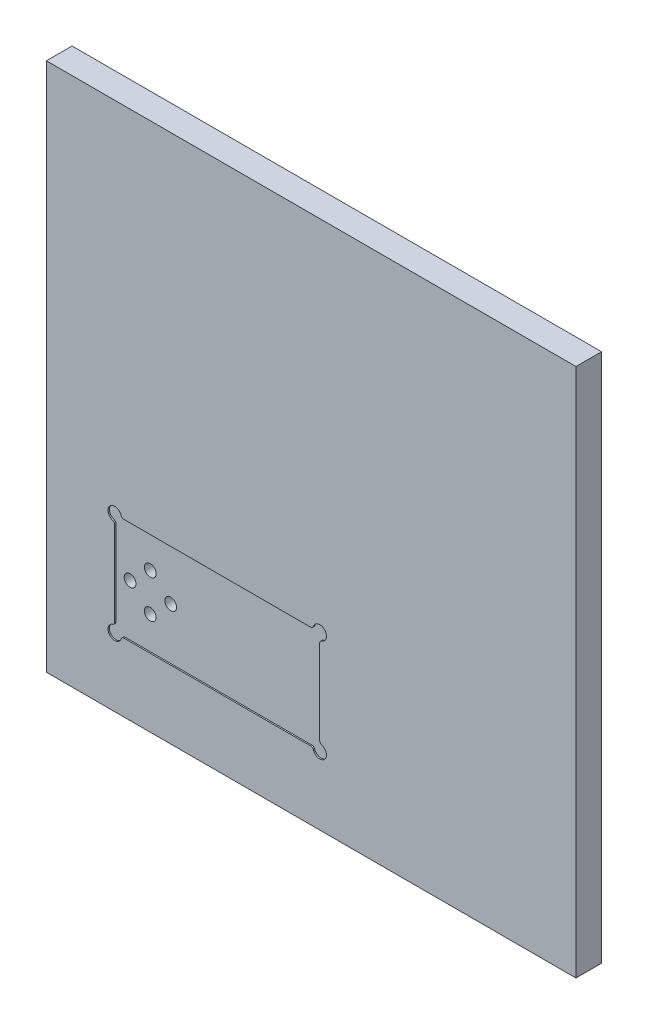
ISO-10303-21;
HEADER;
FILE_DESCRIPTION(('STEP AP214'),'2;1');
FILE_NAME('part.step','',(''),(''),'','','');
FILE_SCHEMA(('AUTOMOTIVE_DESIGN { 1 0 10303 214 1 1 1 1 }'));
ENDSEC;
DATA;
#1=APPLICATION_CONTEXT('core data for automotive mechanical design processes');
#2=APPLICATION_PROTOCOL_DEFINITION('international standard','automotive_design',2000,#1);
#3=PRODUCT_CONTEXT('',#1,'mechanical');
#4=PRODUCT('Part','Part','',(#3));
#5=PRODUCT_RELATED_PRODUCT_CATEGORY('part','',(#4));
#6=PRODUCT_DEFINITION_FORMATION('','',#4);
#7=PRODUCT_DEFINITION_CONTEXT('part definition',#1,'design');
#8=PRODUCT_DEFINITION('design','',#6,#7);
#9=PRODUCT_DEFINITION_SHAPE('','',#8);
#10=(LENGTH_UNIT() NAMED_UNIT(*) SI_UNIT(.MILLI.,.METRE.));
#11=(NAMED_UNIT(*) PLANE_ANGLE_UNIT() SI_UNIT($,.RADIAN.));
#12=(NAMED_UNIT(*) SI_UNIT($,.STERADIAN.) SOLID_ANGLE_UNIT());
#13=UNCERTAINTY_MEASURE_WITH_UNIT(LENGTH_MEASURE(1.E-05),#10,'distance_accuracy_value','');
#14=(GEOMETRIC_REPRESENTATION_CONTEXT(3) GLOBAL_UNCERTAINTY_ASSIGNED_CONTEXT((#13)) GLOBAL_UNIT_ASSIGNED_CONTEXT((#10,
#11,#12)) REPRESENTATION_CONTEXT('',''));
#15=CARTESIAN_POINT('',(0.,0.,0.));
#16=DIRECTION('',(0.,0.,1.));
#17=DIRECTION('',(1.,0.,0.));
#18=AXIS2_PLACEMENT_3D('',#15,#16,#17);
#19=CARTESIAN_POINT('',(0.,0.,19.05));
#20=DIRECTION('',(1.,0.,0.));
#21=DIRECTION('',(0.,0.,-1.));
#22=AXIS2_PLACEMENT_3D('',#19,#20,#21);
#23=PLANE('',#22);
#24=DIRECTION('',(0.,-1.,0.));
#25=VECTOR('',#24,1.);
#26=CARTESIAN_POINT('',(0.,0.,0.));
#27=LINE('',#26,#25);
#28=CARTESIAN_POINT('',(0.,393.7,0.));
#29=VERTEX_POINT('',#28);
#30=CARTESIAN_POINT('',(0.,0.,0.));
#31=VERTEX_POINT('',#30);
#32=EDGE_CURVE('E207',#29,#31,#27,.T.);
#33=ORIENTED_EDGE('',*,*,#32,.T.);
#34=DIRECTION('',(0.,0.,-1.));
#35=VECTOR('',#34,1.);
#36=CARTESIAN_POINT('',(0.,0.,19.05));
#37=LINE('',#36,#35);
#38=CARTESIAN_POINT('',(0.,0.,19.05));
#39=VERTEX_POINT('',#38);
#40=EDGE_CURVE('E186',#39,#31,#37,.T.);
#41=ORIENTED_EDGE('',*,*,#40,.F.);
#42=DIRECTION('',(0.,-1.,0.));
#43=VECTOR('',#42,1.);
#44=CARTESIAN_POINT('',(0.,0.,19.05));
#45=LINE('',#44,#43);
#46=CARTESIAN_POINT('',(0.,393.7,19.05));
#47=VERTEX_POINT('',#46);
#48=EDGE_CURVE('E194',#47,#39,#45,.T.);
#49=ORIENTED_EDGE('',*,*,#48,.F.);
#50=DIRECTION('',(0.,0.,-1.));
#51=VECTOR('',#50,1.);
#52=CARTESIAN_POINT('',(0.,393.7,19.05));
#53=LINE('',#52,#51);
#54=EDGE_CURVE('E320',#47,#29,#53,.T.);
#55=ORIENTED_EDGE('',*,*,#54,.T.);
#56=EDGE_LOOP('',(#33,#41,#49,#55));
#57=FACE_BOUND('',#56,.T.);
#58=ADVANCED_FACE('F44',(#57),#23,.F.);
#59=CARTESIAN_POINT('',(0.,0.,19.05));
#60=DIRECTION('',(0.,1.,0.));
#61=DIRECTION('',(0.,0.,1.));
#62=AXIS2_PLACEMENT_3D('',#59,#60,#61);
#63=PLANE('',#62);
#64=DIRECTION('',(1.,0.,0.));
#65=VECTOR('',#64,1.);
#66=CARTESIAN_POINT('',(0.,0.,0.));
#67=LINE('',#66,#65);
#68=CARTESIAN_POINT('',(393.7,0.,0.));
#69=VERTEX_POINT('',#68);
#70=EDGE_CURVE('E323',#31,#69,#67,.T.);
#71=ORIENTED_EDGE('',*,*,#70,.T.);
#72=DIRECTION('',(0.,0.,-1.));
#73=VECTOR('',#72,1.);
#74=CARTESIAN_POINT('',(393.7,0.,19.05));
#75=LINE('',#74,#73);
#76=CARTESIAN_POINT('',(393.7,0.,19.05));
#77=VERTEX_POINT('',#76);
#78=EDGE_CURVE('E189',#77,#69,#75,.T.);
#79=ORIENTED_EDGE('',*,*,#78,.F.);
#80=DIRECTION('',(1.,0.,0.));
#81=VECTOR('',#80,1.);
#82=CARTESIAN_POINT('',(0.,0.,19.05));
#83=LINE('',#82,#81);
#84=EDGE_CURVE('E182',#39,#77,#83,.T.);
#85=ORIENTED_EDGE('',*,*,#84,.F.);
#86=ORIENTED_EDGE('',*,*,#40,.T.);
#87=EDGE_LOOP('',(#71,#79,#85,#86));
#88=FACE_BOUND('',#87,.T.);
#89=ADVANCED_FACE('F184',(#88),#63,.F.);
#90=CARTESIAN_POINT('',(393.7,0.,19.05));
#91=DIRECTION('',(-1.,0.,0.));
#92=DIRECTION('',(0.,0.,1.));
#93=AXIS2_PLACEMENT_3D('',#90,#91,#92);
#94=PLANE('',#93);
#95=DIRECTION('',(0.,1.,0.));
#96=VECTOR('',#95,1.);
#97=CARTESIAN_POINT('',(393.7,0.,0.));
#98=LINE('',#97,#96);
#99=CARTESIAN_POINT('',(393.7,393.7,0.));
#100=VERTEX_POINT('',#99);
#101=EDGE_CURVE('E326',#69,#100,#98,.T.);
#102=ORIENTED_EDGE('',*,*,#101,.T.);
#103=DIRECTION('',(0.,0.,-1.));
#104=VECTOR('',#103,1.);
#105=CARTESIAN_POINT('',(393.7,393.7,19.05));
#106=LINE('',#105,#104);
#107=CARTESIAN_POINT('',(393.7,393.7,19.05));
#108=VERTEX_POINT('',#107);
#109=EDGE_CURVE('E215',#108,#100,#106,.T.);
#110=ORIENTED_EDGE('',*,*,#109,.F.);
#111=DIRECTION('',(0.,1.,0.));
#112=VECTOR('',#111,1.);
#113=CARTESIAN_POINT('',(393.7,0.,19.05));
#114=LINE('',#113,#112);
#115=EDGE_CURVE('E193',#77,#108,#114,.T.);
#116=ORIENTED_EDGE('',*,*,#115,.F.);
#117=ORIENTED_EDGE('',*,*,#78,.T.);
#118=EDGE_LOOP('',(#102,#110,#116,#117));
#119=FACE_BOUND('',#118,.T.);
#120=ADVANCED_FACE('F342',(#119),#94,.F.);
#121=CARTESIAN_POINT('',(0.,393.7,19.05));
#122=DIRECTION('',(0.,-1.,0.));
#123=DIRECTION('',(0.,0.,-1.));
#124=AXIS2_PLACEMENT_3D('',#121,#122,#123);
#125=PLANE('',#124);
#126=DIRECTION('',(-1.,0.,0.));
#127=VECTOR('',#126,1.);
#128=CARTESIAN_POINT('',(0.,393.7,0.));
#129=LINE('',#128,#127);
#130=EDGE_CURVE('E204',#100,#29,#129,.T.);
#131=ORIENTED_EDGE('',*,*,#130,.T.);
#132=ORIENTED_EDGE('',*,*,#54,.F.);
#133=DIRECTION('',(-1.,0.,0.));
#134=VECTOR('',#133,1.);
#135=CARTESIAN_POINT('',(0.,393.7,19.05));
#136=LINE('',#135,#134);
#137=EDGE_CURVE('E199',#108,#47,#136,.T.);
#138=ORIENTED_EDGE('',*,*,#137,.F.);
#139=ORIENTED_EDGE('',*,*,#109,.T.);
#140=EDGE_LOOP('',(#131,#132,#138,#139));
#141=FACE_BOUND('',#140,.T.);
#142=ADVANCED_FACE('F337',(#141),#125,.F.);
#143=CARTESIAN_POINT('',(0.,0.,19.05));
#144=DIRECTION('',(0.,0.,-1.));
#145=DIRECTION('',(-1.,0.,0.));
#146=AXIS2_PLACEMENT_3D('',#143,#144,#145);
#147=PLANE('',#146);
#148=CARTESIAN_POINT('',(203.2,127.254,19.05));
#149=DIRECTION('',(0.,0.,1.));
#150=DIRECTION('',(1.,0.,0.));
#151=AXIS2_PLACEMENT_3D('',#148,#149,#150);
#152=CIRCLE('',#151,5.);
#153=CARTESIAN_POINT('',(204.628571428571,122.4624257625,19.05));
#154=VERTEX_POINT('',#153);
#155=CARTESIAN_POINT('',(198.4084257625,128.682571428571,19.05));
#156=VERTEX_POINT('',#155);
#157=EDGE_CURVE('E293',#154,#156,#152,.T.);
#158=ORIENTED_EDGE('',*,*,#157,.F.);
#159=CARTESIAN_POINT('',(205.2,120.545796067501,19.05));
#160=DIRECTION('',(0.,0.,-1.));
#161=DIRECTION('',(-1.,0.,0.));
#162=AXIS2_PLACEMENT_3D('',#159,#160,#161);
#163=CIRCLE('',#162,2.);
#164=CARTESIAN_POINT('',(203.2,120.545796067501,19.05));
#165=VERTEX_POINT('',#164);
#166=EDGE_CURVE('E468',#154,#165,#163,.F.);
#167=ORIENTED_EDGE('',*,*,#166,.T.);
#168=DIRECTION('',(0.,1.,0.));
#169=VECTOR('',#168,1.);
#170=CARTESIAN_POINT('',(203.2,55.8,19.05));
#171=LINE('',#170,#169);
#172=CARTESIAN_POINT('',(203.2,57.5082039324994,19.05));
#173=VERTEX_POINT('',#172);
#174=EDGE_CURVE('E288',#173,#165,#171,.T.);
#175=ORIENTED_EDGE('',*,*,#174,.F.);
#176=CARTESIAN_POINT('',(205.2,57.5082039324994,19.05));
#177=DIRECTION('',(0.,0.,-1.));
#178=DIRECTION('',(-1.,0.,0.));
#179=AXIS2_PLACEMENT_3D('',#176,#177,#178);
#180=CIRCLE('',#179,2.);
#181=CARTESIAN_POINT('',(204.628571428571,55.5915742374996,19.05));
#182=VERTEX_POINT('',#181);
#183=EDGE_CURVE('E462',#173,#182,#180,.F.);
#184=ORIENTED_EDGE('',*,*,#183,.T.);
#185=CARTESIAN_POINT('',(203.2,50.8,19.05));
#186=DIRECTION('',(0.,0.,1.));
#187=DIRECTION('',(1.,0.,0.));
#188=AXIS2_PLACEMENT_3D('',#185,#186,#187);
#189=CIRCLE('',#188,5.);
#190=CARTESIAN_POINT('',(198.4084257625,49.3714285714286,19.05));
#191=VERTEX_POINT('',#190);
#192=EDGE_CURVE('E284',#191,#182,#189,.T.);
#193=ORIENTED_EDGE('',*,*,#192,.F.);
#194=CARTESIAN_POINT('',(196.491796067501,48.8,19.05));
#195=DIRECTION('',(0.,0.,-1.));
#196=DIRECTION('',(-1.,0.,0.));
#197=AXIS2_PLACEMENT_3D('',#194,#195,#196);
#198=CIRCLE('',#197,2.);
#199=CARTESIAN_POINT('',(196.491796067501,50.8,19.05));
#200=VERTEX_POINT('',#199);
#201=EDGE_CURVE('E457',#191,#200,#198,.F.);
#202=ORIENTED_EDGE('',*,*,#201,.T.);
#203=DIRECTION('',(1.,0.,0.));
#204=VECTOR('',#203,1.);
#205=CARTESIAN_POINT('',(55.8,50.8,19.05));
#206=LINE('',#205,#204);
#207=CARTESIAN_POINT('',(57.5082039324994,50.8,19.05));
#208=VERTEX_POINT('',#207);
#209=EDGE_CURVE('E312',#208,#200,#206,.T.);
#210=ORIENTED_EDGE('',*,*,#209,.F.);
#211=CARTESIAN_POINT('',(57.5082039324994,48.8,19.05));
#212=DIRECTION('',(0.,0.,-1.));
#213=DIRECTION('',(-1.,0.,0.));
#214=AXIS2_PLACEMENT_3D('',#211,#212,#213);
#215=CIRCLE('',#214,2.);
#216=CARTESIAN_POINT('',(55.5915742374995,49.3714285714286,19.05));
#217=VERTEX_POINT('',#216);
#218=EDGE_CURVE('E452',#208,#217,#215,.F.);
#219=ORIENTED_EDGE('',*,*,#218,.T.);
#220=CARTESIAN_POINT('',(50.8,50.8,19.05));
#221=DIRECTION('',(0.,0.,1.));
#222=DIRECTION('',(1.,0.,0.));
#223=AXIS2_PLACEMENT_3D('',#220,#221,#222);
#224=CIRCLE('',#223,5.);
#225=CARTESIAN_POINT('',(49.3714285714286,55.5915742374995,19.05));
#226=VERTEX_POINT('',#225);
#227=EDGE_CURVE('E308',#226,#217,#224,.T.);
#228=ORIENTED_EDGE('',*,*,#227,.F.);
#229=CARTESIAN_POINT('',(48.8,57.5082039324994,19.05));
#230=DIRECTION('',(0.,0.,-1.));
#231=DIRECTION('',(-1.,0.,0.));
#232=AXIS2_PLACEMENT_3D('',#229,#230,#231);
#233=CIRCLE('',#232,2.);
#234=CARTESIAN_POINT('',(50.8,57.5082039324994,19.05));
#235=VERTEX_POINT('',#234);
#236=EDGE_CURVE('E448',#226,#235,#233,.F.);
#237=ORIENTED_EDGE('',*,*,#236,.T.);
#238=DIRECTION('',(0.,-1.,0.));
#239=VECTOR('',#238,1.);
#240=CARTESIAN_POINT('',(50.8,55.8,19.05));
#241=LINE('',#240,#239);
#242=CARTESIAN_POINT('',(50.8,120.545796067501,19.05));
#243=VERTEX_POINT('',#242);
#244=EDGE_CURVE('E304',#243,#235,#241,.T.);
#245=ORIENTED_EDGE('',*,*,#244,.F.);
#246=CARTESIAN_POINT('',(48.8,120.545796067501,19.05));
#247=DIRECTION('',(0.,0.,-1.));
#248=DIRECTION('',(-1.,0.,0.));
#249=AXIS2_PLACEMENT_3D('',#246,#247,#248);
#250=CIRCLE('',#249,2.);
#251=CARTESIAN_POINT('',(49.3714285714286,122.4624257625,19.05));
#252=VERTEX_POINT('',#251);
#253=EDGE_CURVE('E223',#243,#252,#250,.F.);
#254=ORIENTED_EDGE('',*,*,#253,.T.);
#255=CARTESIAN_POINT('',(50.8,127.254,19.05));
#256=DIRECTION('',(0.,0.,1.));
#257=DIRECTION('',(1.,0.,0.));
#258=AXIS2_PLACEMENT_3D('',#255,#256,#257);
#259=CIRCLE('',#258,5.);
#260=CARTESIAN_POINT('',(55.5915742374995,128.682571428571,19.05));
#261=VERTEX_POINT('',#260);
#262=EDGE_CURVE('E301',#261,#252,#259,.T.);
#263=ORIENTED_EDGE('',*,*,#262,.F.);
#264=CARTESIAN_POINT('',(57.5082039324994,129.254,19.05));
#265=DIRECTION('',(0.,0.,-1.));
#266=DIRECTION('',(-1.,0.,0.));
#267=AXIS2_PLACEMENT_3D('',#264,#265,#266);
#268=CIRCLE('',#267,2.);
#269=CARTESIAN_POINT('',(57.5082039324994,127.254,19.05));
#270=VERTEX_POINT('',#269);
#271=EDGE_CURVE('E453',#261,#270,#268,.F.);
#272=ORIENTED_EDGE('',*,*,#271,.T.);
#273=DIRECTION('',(-1.,0.,0.));
#274=VECTOR('',#273,1.);
#275=CARTESIAN_POINT('',(55.8,127.254,19.05));
#276=LINE('',#275,#274);
#277=CARTESIAN_POINT('',(196.491796067501,127.254,19.05));
#278=VERTEX_POINT('',#277);
#279=EDGE_CURVE('E297',#278,#270,#276,.T.);
#280=ORIENTED_EDGE('',*,*,#279,.F.);
#281=CARTESIAN_POINT('',(196.491796067501,129.254,19.05));
#282=DIRECTION('',(0.,0.,-1.));
#283=DIRECTION('',(-1.,0.,0.));
#284=AXIS2_PLACEMENT_3D('',#281,#282,#283);
#285=CIRCLE('',#284,2.);
#286=EDGE_CURVE('E465',#278,#156,#285,.F.);
#287=ORIENTED_EDGE('',*,*,#286,.T.);
#288=EDGE_LOOP('',(#158,#167,#175,#184,#193,#202,#210,#219,#228,#237,#245,#254,#263,#272,#280,#287));
#289=FACE_BOUND('',#288,.T.);
#290=ORIENTED_EDGE('',*,*,#48,.T.);
#291=ORIENTED_EDGE('',*,*,#84,.T.);
#292=ORIENTED_EDGE('',*,*,#115,.T.);
#293=ORIENTED_EDGE('',*,*,#137,.T.);
#294=EDGE_LOOP('',(#290,#291,#292,#293));
#295=FACE_BOUND('',#294,.T.);
#296=ADVANCED_FACE('F197',(#289,#295),#147,.F.);
#297=CARTESIAN_POINT('',(0.,0.,0.));
#298=DIRECTION('',(0.,0.,-1.));
#299=DIRECTION('',(-1.,0.,0.));
#300=AXIS2_PLACEMENT_3D('',#297,#298,#299);
#301=PLANE('',#300);
#302=ORIENTED_EDGE('',*,*,#32,.F.);
#303=ORIENTED_EDGE('',*,*,#130,.F.);
#304=ORIENTED_EDGE('',*,*,#101,.F.);
#305=ORIENTED_EDGE('',*,*,#70,.F.);
#306=EDGE_LOOP('',(#302,#303,#304,#305));
#307=FACE_BOUND('',#306,.T.);
#308=ADVANCED_FACE('F341',(#307),#301,.T.);
#309=CARTESIAN_POINT('',(203.2,50.8,18.05));
#310=DIRECTION('',(0.,0.,1.));
#311=DIRECTION('',(1.,0.,0.));
#312=AXIS2_PLACEMENT_3D('',#309,#310,#311);
#313=CYLINDRICAL_SURFACE('',#312,5.);
#314=ORIENTED_EDGE('',*,*,#192,.T.);
#315=DIRECTION('',(0.,0.,1.));
#316=VECTOR('',#315,1.);
#317=CARTESIAN_POINT('',(204.628571428571,55.5915742374996,18.05));
#318=LINE('',#317,#316);
#319=CARTESIAN_POINT('',(204.628571428571,55.5915742374996,18.05));
#320=VERTEX_POINT('',#319);
#321=EDGE_CURVE('E269',#182,#320,#318,.F.);
#322=ORIENTED_EDGE('',*,*,#321,.T.);
#323=CARTESIAN_POINT('',(203.2,50.8,18.05));
#324=DIRECTION('',(0.,0.,1.));
#325=DIRECTION('',(1.,0.,0.));
#326=AXIS2_PLACEMENT_3D('',#323,#324,#325);
#327=CIRCLE('',#326,5.);
#328=CARTESIAN_POINT('',(198.4084257625,49.3714285714286,18.05));
#329=VERTEX_POINT('',#328);
#330=EDGE_CURVE('E240',#329,#320,#327,.T.);
#331=ORIENTED_EDGE('',*,*,#330,.F.);
#332=DIRECTION('',(0.,0.,1.));
#333=VECTOR('',#332,1.);
#334=CARTESIAN_POINT('',(198.4084257625,49.3714285714286,18.05));
#335=LINE('',#334,#333);
#336=EDGE_CURVE('E262',#329,#191,#335,.T.);
#337=ORIENTED_EDGE('',*,*,#336,.T.);
#338=EDGE_LOOP('',(#314,#322,#331,#337));
#339=FACE_BOUND('',#338,.T.);
#340=ADVANCED_FACE('F507',(#339),#313,.F.);
#341=CARTESIAN_POINT('',(55.8,50.8,18.05));
#342=DIRECTION('',(0.,-1.,0.));
#343=DIRECTION('',(0.,0.,-1.));
#344=AXIS2_PLACEMENT_3D('',#341,#342,#343);
#345=PLANE('',#344);
#346=ORIENTED_EDGE('',*,*,#209,.T.);
#347=DIRECTION('',(0.,0.,1.));
#348=VECTOR('',#347,1.);
#349=CARTESIAN_POINT('',(196.491796067501,50.8,18.05));
#350=LINE('',#349,#348);
#351=CARTESIAN_POINT('',(196.491796067501,50.8,18.05));
#352=VERTEX_POINT('',#351);
#353=EDGE_CURVE('E761',#200,#352,#350,.F.);
#354=ORIENTED_EDGE('',*,*,#353,.T.);
#355=DIRECTION('',(1.,0.,0.));
#356=VECTOR('',#355,1.);
#357=CARTESIAN_POINT('',(55.8,50.8,18.05));
#358=LINE('',#357,#356);
#359=CARTESIAN_POINT('',(57.5082039324994,50.8,18.05));
#360=VERTEX_POINT('',#359);
#361=EDGE_CURVE('E276',#360,#352,#358,.T.);
#362=ORIENTED_EDGE('',*,*,#361,.F.);
#363=DIRECTION('',(0.,0.,1.));
#364=VECTOR('',#363,1.);
#365=CARTESIAN_POINT('',(57.5082039324994,50.8,18.05));
#366=LINE('',#365,#364);
#367=EDGE_CURVE('E766',#360,#208,#366,.T.);
#368=ORIENTED_EDGE('',*,*,#367,.T.);
#369=EDGE_LOOP('',(#346,#354,#362,#368));
#370=FACE_BOUND('',#369,.T.);
#371=ADVANCED_FACE('F510',(#370),#345,.F.);
#372=CARTESIAN_POINT('',(50.8,50.8,18.05));
#373=DIRECTION('',(0.,0.,1.));
#374=DIRECTION('',(1.,0.,0.));
#375=AXIS2_PLACEMENT_3D('',#372,#373,#374);
#376=CYLINDRICAL_SURFACE('',#375,5.);
#377=ORIENTED_EDGE('',*,*,#227,.T.);
#378=DIRECTION('',(0.,0.,1.));
#379=VECTOR('',#378,1.);
#380=CARTESIAN_POINT('',(55.5915742374995,49.3714285714286,18.05));
#381=LINE('',#380,#379);
#382=CARTESIAN_POINT('',(55.5915742374995,49.3714285714286,18.05));
#383=VERTEX_POINT('',#382);
#384=EDGE_CURVE('E423',#217,#383,#381,.F.);
#385=ORIENTED_EDGE('',*,*,#384,.T.);
#386=CARTESIAN_POINT('',(50.8,50.8,18.05));
#387=DIRECTION('',(0.,0.,1.));
#388=DIRECTION('',(1.,0.,0.));
#389=AXIS2_PLACEMENT_3D('',#386,#387,#388);
#390=CIRCLE('',#389,5.);
#391=CARTESIAN_POINT('',(49.3714285714286,55.5915742374995,18.05));
#392=VERTEX_POINT('',#391);
#393=EDGE_CURVE('E282',#392,#383,#390,.T.);
#394=ORIENTED_EDGE('',*,*,#393,.F.);
#395=DIRECTION('',(0.,0.,1.));
#396=VECTOR('',#395,1.);
#397=CARTESIAN_POINT('',(49.3714285714286,55.5915742374995,18.05));
#398=LINE('',#397,#396);
#399=EDGE_CURVE('E771',#392,#226,#398,.T.);
#400=ORIENTED_EDGE('',*,*,#399,.T.);
#401=EDGE_LOOP('',(#377,#385,#394,#400));
#402=FACE_BOUND('',#401,.T.);
#403=ADVANCED_FACE('F497',(#402),#376,.F.);
#404=CARTESIAN_POINT('',(50.8,55.8,18.05));
#405=DIRECTION('',(-1.,0.,0.));
#406=DIRECTION('',(0.,-1.,0.));
#407=AXIS2_PLACEMENT_3D('',#404,#405,#406);
#408=PLANE('',#407);
#409=ORIENTED_EDGE('',*,*,#244,.T.);
#410=DIRECTION('',(0.,0.,1.));
#411=VECTOR('',#410,1.);
#412=CARTESIAN_POINT('',(50.8,57.5082039324994,18.05));
#413=LINE('',#412,#411);
#414=CARTESIAN_POINT('',(50.8,57.5082039324994,18.05));
#415=VERTEX_POINT('',#414);
#416=EDGE_CURVE('E415',#235,#415,#413,.F.);
#417=ORIENTED_EDGE('',*,*,#416,.T.);
#418=DIRECTION('',(0.,-1.,0.));
#419=VECTOR('',#418,1.);
#420=CARTESIAN_POINT('',(50.8,55.8,18.05));
#421=LINE('',#420,#419);
#422=CARTESIAN_POINT('',(50.8,120.545796067501,18.05));
#423=VERTEX_POINT('',#422);
#424=EDGE_CURVE('E428',#423,#415,#421,.T.);
#425=ORIENTED_EDGE('',*,*,#424,.F.);
#426=DIRECTION('',(0.,0.,1.));
#427=VECTOR('',#426,1.);
#428=CARTESIAN_POINT('',(50.8,120.545796067501,18.05));
#429=LINE('',#428,#427);
#430=EDGE_CURVE('E418',#423,#243,#429,.T.);
#431=ORIENTED_EDGE('',*,*,#430,.T.);
#432=EDGE_LOOP('',(#409,#417,#425,#431));
#433=FACE_BOUND('',#432,.T.);
#434=ADVANCED_FACE('F442',(#433),#408,.F.);
#435=CARTESIAN_POINT('',(50.8,127.254,18.05));
#436=DIRECTION('',(0.,0.,1.));
#437=DIRECTION('',(1.,0.,0.));
#438=AXIS2_PLACEMENT_3D('',#435,#436,#437);
#439=CYLINDRICAL_SURFACE('',#438,5.);
#440=CARTESIAN_POINT('',(50.8,127.254,18.05));
#441=DIRECTION('',(0.,0.,1.));
#442=DIRECTION('',(1.,0.,0.));
#443=AXIS2_PLACEMENT_3D('',#440,#441,#442);
#444=CIRCLE('',#443,5.);
#445=CARTESIAN_POINT('',(55.5915742374995,128.682571428571,18.05));
#446=VERTEX_POINT('',#445);
#447=CARTESIAN_POINT('',(49.3714285714286,122.4624257625,18.05));
#448=VERTEX_POINT('',#447);
#449=EDGE_CURVE('E251',#446,#448,#444,.T.);
#450=ORIENTED_EDGE('',*,*,#449,.F.);
#451=DIRECTION('',(0.,0.,1.));
#452=VECTOR('',#451,1.);
#453=CARTESIAN_POINT('',(55.5915742374995,128.682571428571,18.05));
#454=LINE('',#453,#452);
#455=EDGE_CURVE('E390',#446,#261,#454,.T.);
#456=ORIENTED_EDGE('',*,*,#455,.T.);
#457=ORIENTED_EDGE('',*,*,#262,.T.);
#458=DIRECTION('',(0.,0.,1.));
#459=VECTOR('',#458,1.);
#460=CARTESIAN_POINT('',(49.3714285714286,122.4624257625,18.05));
#461=LINE('',#460,#459);
#462=EDGE_CURVE('E60',#252,#448,#461,.F.);
#463=ORIENTED_EDGE('',*,*,#462,.T.);
#464=EDGE_LOOP('',(#450,#456,#457,#463));
#465=FACE_BOUND('',#464,.T.);
#466=ADVANCED_FACE('F488',(#465),#439,.F.);
#467=CARTESIAN_POINT('',(55.8,127.254,18.05));
#468=DIRECTION('',(0.,1.,0.));
#469=DIRECTION('',(0.,0.,1.));
#470=AXIS2_PLACEMENT_3D('',#467,#468,#469);
#471=PLANE('',#470);
#472=DIRECTION('',(-1.,0.,0.));
#473=VECTOR('',#472,1.);
#474=CARTESIAN_POINT('',(55.8,127.254,18.05));
#475=LINE('',#474,#473);
#476=CARTESIAN_POINT('',(196.491796067501,127.254,18.05));
#477=VERTEX_POINT('',#476);
#478=CARTESIAN_POINT('',(57.5082039324994,127.254,18.05));
#479=VERTEX_POINT('',#478);
#480=EDGE_CURVE('E247',#477,#479,#475,.T.);
#481=ORIENTED_EDGE('',*,*,#480,.F.);
#482=DIRECTION('',(0.,0.,1.));
#483=VECTOR('',#482,1.);
#484=CARTESIAN_POINT('',(196.491796067501,127.254,18.05));
#485=LINE('',#484,#483);
#486=EDGE_CURVE('E256',#477,#278,#485,.T.);
#487=ORIENTED_EDGE('',*,*,#486,.T.);
#488=ORIENTED_EDGE('',*,*,#279,.T.);
#489=DIRECTION('',(0.,0.,1.));
#490=VECTOR('',#489,1.);
#491=CARTESIAN_POINT('',(57.5082039324994,127.254,18.05));
#492=LINE('',#491,#490);
#493=EDGE_CURVE('E263',#270,#479,#492,.F.);
#494=ORIENTED_EDGE('',*,*,#493,.T.);
#495=EDGE_LOOP('',(#481,#487,#488,#494));
#496=FACE_BOUND('',#495,.T.);
#497=ADVANCED_FACE('F482',(#496),#471,.F.);
#498=CARTESIAN_POINT('',(203.2,127.254,18.05));
#499=DIRECTION('',(0.,0.,1.));
#500=DIRECTION('',(1.,0.,0.));
#501=AXIS2_PLACEMENT_3D('',#498,#499,#500);
#502=CYLINDRICAL_SURFACE('',#501,5.);
#503=CARTESIAN_POINT('',(203.2,127.254,18.05));
#504=DIRECTION('',(0.,0.,1.));
#505=DIRECTION('',(1.,0.,0.));
#506=AXIS2_PLACEMENT_3D('',#503,#504,#505);
#507=CIRCLE('',#506,5.);
#508=CARTESIAN_POINT('',(204.628571428571,122.4624257625,18.05));
#509=VERTEX_POINT('',#508);
#510=CARTESIAN_POINT('',(198.4084257625,128.682571428571,18.05));
#511=VERTEX_POINT('',#510);
#512=EDGE_CURVE('E239',#509,#511,#507,.T.);
#513=ORIENTED_EDGE('',*,*,#512,.F.);
#514=DIRECTION('',(0.,0.,1.));
#515=VECTOR('',#514,1.);
#516=CARTESIAN_POINT('',(204.628571428571,122.4624257625,18.05));
#517=LINE('',#516,#515);
#518=EDGE_CURVE('E213',#509,#154,#517,.T.);
#519=ORIENTED_EDGE('',*,*,#518,.T.);
#520=ORIENTED_EDGE('',*,*,#157,.T.);
#521=DIRECTION('',(0.,0.,1.));
#522=VECTOR('',#521,1.);
#523=CARTESIAN_POINT('',(198.4084257625,128.682571428571,18.05));
#524=LINE('',#523,#522);
#525=EDGE_CURVE('E209',#156,#511,#524,.F.);
#526=ORIENTED_EDGE('',*,*,#525,.T.);
#527=EDGE_LOOP('',(#513,#519,#520,#526));
#528=FACE_BOUND('',#527,.T.);
#529=ADVANCED_FACE('F495',(#528),#502,.F.);
#530=CARTESIAN_POINT('',(203.2,55.8,18.05));
#531=DIRECTION('',(1.,0.,0.));
#532=DIRECTION('',(0.,0.,-1.));
#533=AXIS2_PLACEMENT_3D('',#530,#531,#532);
#534=PLANE('',#533);
#535=ORIENTED_EDGE('',*,*,#174,.T.);
#536=DIRECTION('',(0.,0.,1.));
#537=VECTOR('',#536,1.);
#538=CARTESIAN_POINT('',(203.2,120.545796067501,18.05));
#539=LINE('',#538,#537);
#540=CARTESIAN_POINT('',(203.2,120.545796067501,18.05));
#541=VERTEX_POINT('',#540);
#542=EDGE_CURVE('E474',#165,#541,#539,.F.);
#543=ORIENTED_EDGE('',*,*,#542,.T.);
#544=DIRECTION('',(0.,1.,0.));
#545=VECTOR('',#544,1.);
#546=CARTESIAN_POINT('',(203.2,55.8,18.05));
#547=LINE('',#546,#545);
#548=CARTESIAN_POINT('',(203.2,57.5082039324994,18.05));
#549=VERTEX_POINT('',#548);
#550=EDGE_CURVE('E234',#549,#541,#547,.T.);
#551=ORIENTED_EDGE('',*,*,#550,.F.);
#552=DIRECTION('',(0.,0.,1.));
#553=VECTOR('',#552,1.);
#554=CARTESIAN_POINT('',(203.2,57.5082039324994,18.05));
#555=LINE('',#554,#553);
#556=EDGE_CURVE('E470',#549,#173,#555,.T.);
#557=ORIENTED_EDGE('',*,*,#556,.T.);
#558=EDGE_LOOP('',(#535,#543,#551,#557));
#559=FACE_BOUND('',#558,.T.);
#560=ADVANCED_FACE('F503',(#559),#534,.F.);
#561=CARTESIAN_POINT('',(203.2,50.8,18.05));
#562=DIRECTION('',(0.,0.,1.));
#563=DIRECTION('',(1.,0.,0.));
#564=AXIS2_PLACEMENT_3D('',#561,#562,#563);
#565=PLANE('',#564);
#566=CARTESIAN_POINT('',(61.2,89.2,18.05));
#567=DIRECTION('',(0.,0.,1.));
#568=DIRECTION('',(1.,0.,0.));
#569=AXIS2_PLACEMENT_3D('',#566,#567,#568);
#570=CIRCLE('',#569,4.365625);
#571=CARTESIAN_POINT('',(65.565625,89.2,18.05));
#572=VERTEX_POINT('',#571);
#573=EDGE_CURVE('E733',#572,#572,#570,.T.);
#574=ORIENTED_EDGE('',*,*,#573,.F.);
#575=EDGE_LOOP('',(#574));
#576=FACE_BOUND('',#575,.T.);
#577=CARTESIAN_POINT('',(91.4,89.2,18.05));
#578=DIRECTION('',(0.,0.,1.));
#579=DIRECTION('',(1.,0.,0.));
#580=AXIS2_PLACEMENT_3D('',#577,#578,#579);
#581=CIRCLE('',#580,4.365625);
#582=CARTESIAN_POINT('',(95.765625,89.2,18.05));
#583=VERTEX_POINT('',#582);
#584=EDGE_CURVE('E725',#583,#583,#581,.T.);
#585=ORIENTED_EDGE('',*,*,#584,.F.);
#586=EDGE_LOOP('',(#585));
#587=FACE_BOUND('',#586,.T.);
#588=CARTESIAN_POINT('',(76.2,75.,18.05));
#589=DIRECTION('',(0.,0.,1.));
#590=DIRECTION('',(1.,0.,0.));
#591=AXIS2_PLACEMENT_3D('',#588,#589,#590);
#592=CIRCLE('',#591,4.365625);
#593=CARTESIAN_POINT('',(80.565625,75.,18.05));
#594=VERTEX_POINT('',#593);
#595=EDGE_CURVE('E715',#594,#594,#592,.T.);
#596=ORIENTED_EDGE('',*,*,#595,.F.);
#597=EDGE_LOOP('',(#596));
#598=FACE_BOUND('',#597,.T.);
#599=CARTESIAN_POINT('',(76.2,103.2,18.05));
#600=DIRECTION('',(0.,0.,1.));
#601=DIRECTION('',(1.,0.,0.));
#602=AXIS2_PLACEMENT_3D('',#599,#600,#601);
#603=CIRCLE('',#602,4.365625);
#604=CARTESIAN_POINT('',(80.565625,103.2,18.05));
#605=VERTEX_POINT('',#604);
#606=EDGE_CURVE('E711',#605,#605,#603,.T.);
#607=ORIENTED_EDGE('',*,*,#606,.F.);
#608=EDGE_LOOP('',(#607));
#609=FACE_BOUND('',#608,.T.);
#610=ORIENTED_EDGE('',*,*,#361,.T.);
#611=CARTESIAN_POINT('',(196.491796067501,48.8,18.05));
#612=DIRECTION('',(0.,0.,1.));
#613=DIRECTION('',(1.,0.,0.));
#614=AXIS2_PLACEMENT_3D('',#611,#612,#613);
#615=CIRCLE('',#614,2.);
#616=EDGE_CURVE('E399',#352,#329,#615,.F.);
#617=ORIENTED_EDGE('',*,*,#616,.T.);
#618=ORIENTED_EDGE('',*,*,#330,.T.);
#619=CARTESIAN_POINT('',(205.2,57.5082039324994,18.05));
#620=DIRECTION('',(0.,0.,1.));
#621=DIRECTION('',(1.,0.,0.));
#622=AXIS2_PLACEMENT_3D('',#619,#620,#621);
#623=CIRCLE('',#622,2.);
#624=EDGE_CURVE('E402',#320,#549,#623,.F.);
#625=ORIENTED_EDGE('',*,*,#624,.T.);
#626=ORIENTED_EDGE('',*,*,#550,.T.);
#627=CARTESIAN_POINT('',(205.2,120.545796067501,18.05));
#628=DIRECTION('',(0.,0.,1.));
#629=DIRECTION('',(1.,0.,0.));
#630=AXIS2_PLACEMENT_3D('',#627,#628,#629);
#631=CIRCLE('',#630,2.);
#632=EDGE_CURVE('E408',#541,#509,#631,.F.);
#633=ORIENTED_EDGE('',*,*,#632,.T.);
#634=ORIENTED_EDGE('',*,*,#512,.T.);
#635=CARTESIAN_POINT('',(196.491796067501,129.254,18.05));
#636=DIRECTION('',(0.,0.,1.));
#637=DIRECTION('',(1.,0.,0.));
#638=AXIS2_PLACEMENT_3D('',#635,#636,#637);
#639=CIRCLE('',#638,2.);
#640=EDGE_CURVE('E405',#511,#477,#639,.F.);
#641=ORIENTED_EDGE('',*,*,#640,.T.);
#642=ORIENTED_EDGE('',*,*,#480,.T.);
#643=CARTESIAN_POINT('',(57.5082039324994,129.254,18.05));
#644=DIRECTION('',(0.,0.,1.));
#645=DIRECTION('',(1.,0.,0.));
#646=AXIS2_PLACEMENT_3D('',#643,#644,#645);
#647=CIRCLE('',#646,2.);
#648=EDGE_CURVE('E53',#479,#446,#647,.F.);
#649=ORIENTED_EDGE('',*,*,#648,.T.);
#650=ORIENTED_EDGE('',*,*,#449,.T.);
#651=CARTESIAN_POINT('',(48.8,120.545796067501,18.05));
#652=DIRECTION('',(0.,0.,1.));
#653=DIRECTION('',(1.,0.,0.));
#654=AXIS2_PLACEMENT_3D('',#651,#652,#653);
#655=CIRCLE('',#654,2.);
#656=EDGE_CURVE('E12',#448,#423,#655,.F.);
#657=ORIENTED_EDGE('',*,*,#656,.T.);
#658=ORIENTED_EDGE('',*,*,#424,.T.);
#659=CARTESIAN_POINT('',(48.8,57.5082039324994,18.05));
#660=DIRECTION('',(0.,0.,1.));
#661=DIRECTION('',(1.,0.,0.));
#662=AXIS2_PLACEMENT_3D('',#659,#660,#661);
#663=CIRCLE('',#662,2.);
#664=EDGE_CURVE('E392',#415,#392,#663,.F.);
#665=ORIENTED_EDGE('',*,*,#664,.T.);
#666=ORIENTED_EDGE('',*,*,#393,.T.);
#667=CARTESIAN_POINT('',(57.5082039324994,48.8,18.05));
#668=DIRECTION('',(0.,0.,1.));
#669=DIRECTION('',(1.,0.,0.));
#670=AXIS2_PLACEMENT_3D('',#667,#668,#669);
#671=CIRCLE('',#670,2.);
#672=EDGE_CURVE('E394',#383,#360,#671,.F.);
#673=ORIENTED_EDGE('',*,*,#672,.T.);
#674=EDGE_LOOP('',(#610,#617,#618,#625,#626,#633,#634,#641,#642,#649,#650,#657,#658,#665,#666,#673));
#675=FACE_BOUND('',#674,.T.);
#676=ADVANCED_FACE('F438',(#576,#587,#598,#609,#675),#565,.T.);
#677=CARTESIAN_POINT('',(76.2,103.2,5.55));
#678=DIRECTION('',(0.,0.,1.));
#679=DIRECTION('',(1.,0.,0.));
#680=AXIS2_PLACEMENT_3D('',#677,#678,#679);
#681=CYLINDRICAL_SURFACE('',#680,4.365625);
#682=CARTESIAN_POINT('',(76.2,103.2,5.55));
#683=DIRECTION('',(0.,0.,1.));
#684=DIRECTION('',(1.,0.,0.));
#685=AXIS2_PLACEMENT_3D('',#682,#683,#684);
#686=CIRCLE('',#685,4.365625);
#687=CARTESIAN_POINT('',(80.565625,103.2,5.55));
#688=VERTEX_POINT('',#687);
#689=EDGE_CURVE('E708',#688,#688,#686,.T.);
#690=ORIENTED_EDGE('',*,*,#689,.F.);
#691=EDGE_LOOP('',(#690));
#692=FACE_BOUND('',#691,.T.);
#693=ORIENTED_EDGE('',*,*,#606,.T.);
#694=EDGE_LOOP('',(#693));
#695=FACE_BOUND('',#694,.T.);
#696=ADVANCED_FACE('F573',(#692,#695),#681,.F.);
#697=CARTESIAN_POINT('',(76.2,103.2,5.55));
#698=DIRECTION('',(0.,0.,1.));
#699=DIRECTION('',(1.,0.,0.));
#700=AXIS2_PLACEMENT_3D('',#697,#698,#699);
#701=PLANE('',#700);
#702=ORIENTED_EDGE('',*,*,#689,.T.);
#703=EDGE_LOOP('',(#702));
#704=FACE_BOUND('',#703,.T.);
#705=ADVANCED_FACE('F670',(#704),#701,.T.);
#706=CARTESIAN_POINT('',(76.2,75.,5.55));
#707=DIRECTION('',(0.,0.,1.));
#708=DIRECTION('',(1.,0.,0.));
#709=AXIS2_PLACEMENT_3D('',#706,#707,#708);
#710=CYLINDRICAL_SURFACE('',#709,4.365625);
#711=CARTESIAN_POINT('',(76.2,75.,5.55));
#712=DIRECTION('',(0.,0.,1.));
#713=DIRECTION('',(1.,0.,0.));
#714=AXIS2_PLACEMENT_3D('',#711,#712,#713);
#715=CIRCLE('',#714,4.365625);
#716=CARTESIAN_POINT('',(80.565625,75.,5.55));
#717=VERTEX_POINT('',#716);
#718=EDGE_CURVE('E721',#717,#717,#715,.T.);
#719=ORIENTED_EDGE('',*,*,#718,.F.);
#720=EDGE_LOOP('',(#719));
#721=FACE_BOUND('',#720,.T.);
#722=ORIENTED_EDGE('',*,*,#595,.T.);
#723=EDGE_LOOP('',(#722));
#724=FACE_BOUND('',#723,.T.);
#725=ADVANCED_FACE('F662',(#721,#724),#710,.F.);
#726=CARTESIAN_POINT('',(76.2,75.,5.55));
#727=DIRECTION('',(0.,0.,1.));
#728=DIRECTION('',(1.,0.,0.));
#729=AXIS2_PLACEMENT_3D('',#726,#727,#728);
#730=PLANE('',#729);
#731=ORIENTED_EDGE('',*,*,#718,.T.);
#732=EDGE_LOOP('',(#731));
#733=FACE_BOUND('',#732,.T.);
#734=ADVANCED_FACE('F655',(#733),#730,.T.);
#735=CARTESIAN_POINT('',(91.4,89.2,5.55));
#736=DIRECTION('',(0.,0.,1.));
#737=DIRECTION('',(1.,0.,0.));
#738=AXIS2_PLACEMENT_3D('',#735,#736,#737);
#739=CYLINDRICAL_SURFACE('',#738,4.365625);
#740=CARTESIAN_POINT('',(91.4,89.2,5.55));
#741=DIRECTION('',(0.,0.,1.));
#742=DIRECTION('',(1.,0.,0.));
#743=AXIS2_PLACEMENT_3D('',#740,#741,#742);
#744=CIRCLE('',#743,4.365625);
#745=CARTESIAN_POINT('',(95.765625,89.2,5.55));
#746=VERTEX_POINT('',#745);
#747=EDGE_CURVE('E729',#746,#746,#744,.T.);
#748=ORIENTED_EDGE('',*,*,#747,.F.);
#749=EDGE_LOOP('',(#748));
#750=FACE_BOUND('',#749,.T.);
#751=ORIENTED_EDGE('',*,*,#584,.T.);
#752=EDGE_LOOP('',(#751));
#753=FACE_BOUND('',#752,.T.);
#754=ADVANCED_FACE('F646',(#750,#753),#739,.F.);
#755=CARTESIAN_POINT('',(91.4,89.2,5.55));
#756=DIRECTION('',(0.,0.,1.));
#757=DIRECTION('',(1.,0.,0.));
#758=AXIS2_PLACEMENT_3D('',#755,#756,#757);
#759=PLANE('',#758);
#760=ORIENTED_EDGE('',*,*,#747,.T.);
#761=EDGE_LOOP('',(#760));
#762=FACE_BOUND('',#761,.T.);
#763=ADVANCED_FACE('F639',(#762),#759,.T.);
#764=CARTESIAN_POINT('',(61.2,89.2,5.55));
#765=DIRECTION('',(0.,0.,1.));
#766=DIRECTION('',(1.,0.,0.));
#767=AXIS2_PLACEMENT_3D('',#764,#765,#766);
#768=CYLINDRICAL_SURFACE('',#767,4.365625);
#769=CARTESIAN_POINT('',(61.2,89.2,5.55));
#770=DIRECTION('',(0.,0.,1.));
#771=DIRECTION('',(1.,0.,0.));
#772=AXIS2_PLACEMENT_3D('',#769,#770,#771);
#773=CIRCLE('',#772,4.365625);
#774=CARTESIAN_POINT('',(65.565625,89.2,5.55));
#775=VERTEX_POINT('',#774);
#776=EDGE_CURVE('E289',#775,#775,#773,.T.);
#777=ORIENTED_EDGE('',*,*,#776,.F.);
#778=EDGE_LOOP('',(#777));
#779=FACE_BOUND('',#778,.T.);
#780=ORIENTED_EDGE('',*,*,#573,.T.);
#781=EDGE_LOOP('',(#780));
#782=FACE_BOUND('',#781,.T.);
#783=ADVANCED_FACE('F631',(#779,#782),#768,.F.);
#784=CARTESIAN_POINT('',(61.2,89.2,5.55));
#785=DIRECTION('',(0.,0.,1.));
#786=DIRECTION('',(1.,0.,0.));
#787=AXIS2_PLACEMENT_3D('',#784,#785,#786);
#788=PLANE('',#787);
#789=ORIENTED_EDGE('',*,*,#776,.T.);
#790=EDGE_LOOP('',(#789));
#791=FACE_BOUND('',#790,.T.);
#792=ADVANCED_FACE('F360',(#791),#788,.T.);
#793=CARTESIAN_POINT('',(205.2,120.545796067501,18.05));
#794=DIRECTION('',(0.,0.,1.));
#795=DIRECTION('',(1.,0.,0.));
#796=AXIS2_PLACEMENT_3D('',#793,#794,#795);
#797=CYLINDRICAL_SURFACE('',#796,2.);
#798=ORIENTED_EDGE('',*,*,#632,.F.);
#799=ORIENTED_EDGE('',*,*,#542,.F.);
#800=ORIENTED_EDGE('',*,*,#166,.F.);
#801=ORIENTED_EDGE('',*,*,#518,.F.);
#802=EDGE_LOOP('',(#798,#799,#800,#801));
#803=FACE_BOUND('',#802,.T.);
#804=ADVANCED_FACE('F356',(#803),#797,.T.);
#805=CARTESIAN_POINT('',(196.491796067501,129.254,18.05));
#806=DIRECTION('',(0.,0.,1.));
#807=DIRECTION('',(1.,0.,0.));
#808=AXIS2_PLACEMENT_3D('',#805,#806,#807);
#809=CYLINDRICAL_SURFACE('',#808,2.);
#810=ORIENTED_EDGE('',*,*,#640,.F.);
#811=ORIENTED_EDGE('',*,*,#525,.F.);
#812=ORIENTED_EDGE('',*,*,#286,.F.);
#813=ORIENTED_EDGE('',*,*,#486,.F.);
#814=EDGE_LOOP('',(#810,#811,#812,#813));
#815=FACE_BOUND('',#814,.T.);
#816=ADVANCED_FACE('F359',(#815),#809,.T.);
#817=CARTESIAN_POINT('',(205.2,57.5082039324994,18.05));
#818=DIRECTION('',(0.,0.,1.));
#819=DIRECTION('',(1.,0.,0.));
#820=AXIS2_PLACEMENT_3D('',#817,#818,#819);
#821=CYLINDRICAL_SURFACE('',#820,2.);
#822=ORIENTED_EDGE('',*,*,#624,.F.);
#823=ORIENTED_EDGE('',*,*,#321,.F.);
#824=ORIENTED_EDGE('',*,*,#183,.F.);
#825=ORIENTED_EDGE('',*,*,#556,.F.);
#826=EDGE_LOOP('',(#822,#823,#824,#825));
#827=FACE_BOUND('',#826,.T.);
#828=ADVANCED_FACE('F364',(#827),#821,.T.);
#829=CARTESIAN_POINT('',(196.491796067501,48.8,18.05));
#830=DIRECTION('',(0.,0.,1.));
#831=DIRECTION('',(1.,0.,0.));
#832=AXIS2_PLACEMENT_3D('',#829,#830,#831);
#833=CYLINDRICAL_SURFACE('',#832,2.);
#834=ORIENTED_EDGE('',*,*,#616,.F.);
#835=ORIENTED_EDGE('',*,*,#353,.F.);
#836=ORIENTED_EDGE('',*,*,#201,.F.);
#837=ORIENTED_EDGE('',*,*,#336,.F.);
#838=EDGE_LOOP('',(#834,#835,#836,#837));
#839=FACE_BOUND('',#838,.T.);
#840=ADVANCED_FACE('F368',(#839),#833,.T.);
#841=CARTESIAN_POINT('',(57.5082039324994,48.8,18.05));
#842=DIRECTION('',(0.,0.,1.));
#843=DIRECTION('',(1.,0.,0.));
#844=AXIS2_PLACEMENT_3D('',#841,#842,#843);
#845=CYLINDRICAL_SURFACE('',#844,2.);
#846=ORIENTED_EDGE('',*,*,#672,.F.);
#847=ORIENTED_EDGE('',*,*,#384,.F.);
#848=ORIENTED_EDGE('',*,*,#218,.F.);
#849=ORIENTED_EDGE('',*,*,#367,.F.);
#850=EDGE_LOOP('',(#846,#847,#848,#849));
#851=FACE_BOUND('',#850,.T.);
#852=ADVANCED_FACE('F372',(#851),#845,.T.);
#853=CARTESIAN_POINT('',(48.8,57.5082039324994,18.05));
#854=DIRECTION('',(0.,0.,1.));
#855=DIRECTION('',(1.,0.,0.));
#856=AXIS2_PLACEMENT_3D('',#853,#854,#855);
#857=CYLINDRICAL_SURFACE('',#856,2.);
#858=ORIENTED_EDGE('',*,*,#664,.F.);
#859=ORIENTED_EDGE('',*,*,#416,.F.);
#860=ORIENTED_EDGE('',*,*,#236,.F.);
#861=ORIENTED_EDGE('',*,*,#399,.F.);
#862=EDGE_LOOP('',(#858,#859,#860,#861));
#863=FACE_BOUND('',#862,.T.);
#864=ADVANCED_FACE('F376',(#863),#857,.T.);
#865=CARTESIAN_POINT('',(57.5082039324994,129.254,18.05));
#866=DIRECTION('',(0.,0.,1.));
#867=DIRECTION('',(1.,0.,0.));
#868=AXIS2_PLACEMENT_3D('',#865,#866,#867);
#869=CYLINDRICAL_SURFACE('',#868,2.);
#870=ORIENTED_EDGE('',*,*,#648,.F.);
#871=ORIENTED_EDGE('',*,*,#493,.F.);
#872=ORIENTED_EDGE('',*,*,#271,.F.);
#873=ORIENTED_EDGE('',*,*,#455,.F.);
#874=EDGE_LOOP('',(#870,#871,#872,#873));
#875=FACE_BOUND('',#874,.T.);
#876=ADVANCED_FACE('F379',(#875),#869,.T.);
#877=CARTESIAN_POINT('',(48.8,120.545796067501,18.05));
#878=DIRECTION('',(0.,0.,1.));
#879=DIRECTION('',(1.,0.,0.));
#880=AXIS2_PLACEMENT_3D('',#877,#878,#879);
#881=CYLINDRICAL_SURFACE('',#880,2.);
#882=ORIENTED_EDGE('',*,*,#656,.F.);
#883=ORIENTED_EDGE('',*,*,#462,.F.);
#884=ORIENTED_EDGE('',*,*,#253,.F.);
#885=ORIENTED_EDGE('',*,*,#430,.F.);
#886=EDGE_LOOP('',(#882,#883,#884,#885));
#887=FACE_BOUND('',#886,.T.);
#888=ADVANCED_FACE('F46',(#887),#881,.T.);
#889=CLOSED_SHELL('',(#58,#89,#120,#142,#296,#308,#340,#371,#403,#434,#466,#497,#529,#560,#676,
#696,#705,#725,#734,#754,#763,#783,#792,#804,#816,#828,#840,#852,#864,#876,#888));
#890=MANIFOLD_SOLID_BREP('B2',#889);
#891=ADVANCED_BREP_SHAPE_REPRESENTATION('',(#18,#890),#14);
#892=SHAPE_DEFINITION_REPRESENTATION(#9,#891);
ENDSEC;
END-ISO-10303-21;
